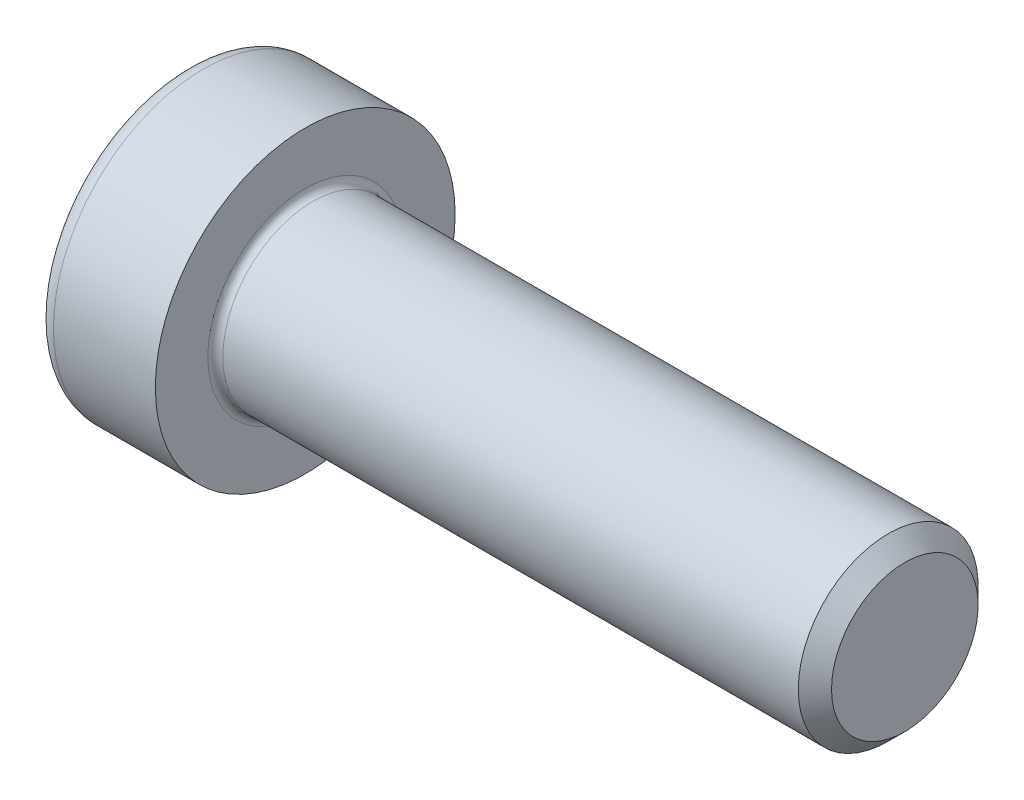
ISO-10303-21;
HEADER;
FILE_DESCRIPTION(('STEP AP214'),'2;1');
FILE_NAME('part.step','',(''),(''),'','','');
FILE_SCHEMA(('AUTOMOTIVE_DESIGN { 1 0 10303 214 1 1 1 1 }'));
ENDSEC;
DATA;
#1=APPLICATION_CONTEXT('core data for automotive mechanical design processes');
#2=APPLICATION_PROTOCOL_DEFINITION('international standard','automotive_design',2000,#1);
#3=PRODUCT_CONTEXT('',#1,'mechanical');
#4=PRODUCT('Part','Part','',(#3));
#5=PRODUCT_RELATED_PRODUCT_CATEGORY('part','',(#4));
#6=PRODUCT_DEFINITION_FORMATION('','',#4);
#7=PRODUCT_DEFINITION_CONTEXT('part definition',#1,'design');
#8=PRODUCT_DEFINITION('design','',#6,#7);
#9=PRODUCT_DEFINITION_SHAPE('','',#8);
#10=(LENGTH_UNIT() NAMED_UNIT(*) SI_UNIT(.MILLI.,.METRE.));
#11=(NAMED_UNIT(*) PLANE_ANGLE_UNIT() SI_UNIT($,.RADIAN.));
#12=(NAMED_UNIT(*) SI_UNIT($,.STERADIAN.) SOLID_ANGLE_UNIT());
#13=UNCERTAINTY_MEASURE_WITH_UNIT(LENGTH_MEASURE(1.E-05),#10,'distance_accuracy_value','');
#14=(GEOMETRIC_REPRESENTATION_CONTEXT(3) GLOBAL_UNCERTAINTY_ASSIGNED_CONTEXT((#13)) GLOBAL_UNIT_ASSIGNED_CONTEXT((#10,
#11,#12)) REPRESENTATION_CONTEXT('',''));
#15=CARTESIAN_POINT('',(0.,0.,0.));
#16=DIRECTION('',(0.,0.,1.));
#17=DIRECTION('',(1.,0.,0.));
#18=AXIS2_PLACEMENT_3D('',#15,#16,#17);
#19=CARTESIAN_POINT('',(0.,0.,0.));
#20=DIRECTION('',(-1.,0.,0.));
#21=DIRECTION('',(0.,0.,1.));
#22=AXIS2_PLACEMENT_3D('',#19,#20,#21);
#23=PLANE('',#22);
#24=DIRECTION('',(0.,-0.499999999999998,0.86602540378444));
#25=VECTOR('',#24,1.);
#26=CARTESIAN_POINT('',(0.,2.30940107675851,0.));
#27=LINE('',#26,#25);
#28=CARTESIAN_POINT('',(0.,2.30940107675851,0.));
#29=VERTEX_POINT('',#28);
#30=CARTESIAN_POINT('',(0.,1.15470053837926,1.99999999999999));
#31=VERTEX_POINT('',#30);
#32=EDGE_CURVE('E296',#29,#31,#27,.T.);
#33=ORIENTED_EDGE('',*,*,#32,.T.);
#34=DIRECTION('',(0.,1.,0.));
#35=VECTOR('',#34,1.);
#36=CARTESIAN_POINT('',(0.,-1.15470053837924,2.));
#37=LINE('',#36,#35);
#38=CARTESIAN_POINT('',(0.,-1.15470053837924,2.));
#39=VERTEX_POINT('',#38);
#40=EDGE_CURVE('E150',#39,#31,#37,.T.);
#41=ORIENTED_EDGE('',*,*,#40,.F.);
#42=DIRECTION('',(0.,-0.500000000000001,-0.866025403784438));
#43=VECTOR('',#42,1.);
#44=CARTESIAN_POINT('',(0.,-1.15470053837924,2.));
#45=LINE('',#44,#43);
#46=CARTESIAN_POINT('',(0.,-2.30940107675849,0.));
#47=VERTEX_POINT('',#46);
#48=EDGE_CURVE('E301',#39,#47,#45,.T.);
#49=ORIENTED_EDGE('',*,*,#48,.T.);
#50=DIRECTION('',(0.,0.499999999999997,-0.86602540378444));
#51=VECTOR('',#50,1.);
#52=CARTESIAN_POINT('',(0.,-2.30940107675849,0.));
#53=LINE('',#52,#51);
#54=CARTESIAN_POINT('',(0.,-1.15470053837925,-2.));
#55=VERTEX_POINT('',#54);
#56=EDGE_CURVE('E305',#47,#55,#53,.T.);
#57=ORIENTED_EDGE('',*,*,#56,.T.);
#58=DIRECTION('',(0.,-1.,0.));
#59=VECTOR('',#58,1.);
#60=CARTESIAN_POINT('',(0.,1.15470053837925,-2.00000000000001));
#61=LINE('',#60,#59);
#62=CARTESIAN_POINT('',(0.,1.15470053837925,-2.00000000000001));
#63=VERTEX_POINT('',#62);
#64=EDGE_CURVE('E309',#63,#55,#61,.T.);
#65=ORIENTED_EDGE('',*,*,#64,.F.);
#66=DIRECTION('',(0.,-0.500000000000001,-0.866025403784438));
#67=VECTOR('',#66,1.);
#68=CARTESIAN_POINT('',(0.,2.30940107675851,0.));
#69=LINE('',#68,#67);
#70=EDGE_CURVE('E145',#29,#63,#69,.T.);
#71=ORIENTED_EDGE('',*,*,#70,.F.);
#72=EDGE_LOOP('',(#33,#41,#49,#57,#65,#71));
#73=FACE_BOUND('',#72,.T.);
#74=CARTESIAN_POINT('',(0.,0.,0.));
#75=DIRECTION('',(-1.,0.,0.));
#76=DIRECTION('',(0.,0.,1.));
#77=AXIS2_PLACEMENT_3D('',#74,#75,#76);
#78=CIRCLE('',#77,4.4);
#79=CARTESIAN_POINT('',(0.,0.,4.4));
#80=VERTEX_POINT('',#79);
#81=EDGE_CURVE('E60',#80,#80,#78,.T.);
#82=ORIENTED_EDGE('',*,*,#81,.T.);
#83=EDGE_LOOP('',(#82));
#84=FACE_BOUND('',#83,.T.);
#85=ADVANCED_FACE('F51',(#73,#84),#23,.T.);
#86=CARTESIAN_POINT('',(-31.75,0.,0.));
#87=DIRECTION('',(-1.,0.,0.));
#88=DIRECTION('',(0.,0.,1.));
#89=AXIS2_PLACEMENT_3D('',#86,#87,#88);
#90=CYLINDRICAL_SURFACE('',#89,5.);
#91=CARTESIAN_POINT('',(0.600000000000003,0.,0.));
#92=DIRECTION('',(-1.,0.,0.));
#93=DIRECTION('',(0.,0.,1.));
#94=AXIS2_PLACEMENT_3D('',#91,#92,#93);
#95=CIRCLE('',#94,5.);
#96=CARTESIAN_POINT('',(0.600000000000003,0.,5.));
#97=VERTEX_POINT('',#96);
#98=EDGE_CURVE('E11',#97,#97,#95,.F.);
#99=ORIENTED_EDGE('',*,*,#98,.T.);
#100=EDGE_LOOP('',(#99));
#101=FACE_BOUND('',#100,.T.);
#102=CARTESIAN_POINT('',(4.,0.,0.));
#103=DIRECTION('',(-1.,0.,0.));
#104=DIRECTION('',(0.,0.,1.));
#105=AXIS2_PLACEMENT_3D('',#102,#103,#104);
#106=CIRCLE('',#105,5.);
#107=CARTESIAN_POINT('',(4.,0.,5.));
#108=VERTEX_POINT('',#107);
#109=EDGE_CURVE('E175',#108,#108,#106,.T.);
#110=ORIENTED_EDGE('',*,*,#109,.T.);
#111=EDGE_LOOP('',(#110));
#112=FACE_BOUND('',#111,.T.);
#113=ADVANCED_FACE('F205',(#101,#112),#90,.T.);
#114=CARTESIAN_POINT('',(4.,5.,0.));
#115=DIRECTION('',(1.,0.,0.));
#116=DIRECTION('',(0.,0.,-1.));
#117=AXIS2_PLACEMENT_3D('',#114,#115,#116);
#118=PLANE('',#117);
#119=CARTESIAN_POINT('',(4.,0.,0.));
#120=DIRECTION('',(1.,0.,0.));
#121=DIRECTION('',(0.,0.,-1.));
#122=AXIS2_PLACEMENT_3D('',#119,#120,#121);
#123=CIRCLE('',#122,3.25);
#124=CARTESIAN_POINT('',(4.,0.,-3.25));
#125=VERTEX_POINT('',#124);
#126=EDGE_CURVE('E179',#125,#125,#123,.F.);
#127=ORIENTED_EDGE('',*,*,#126,.T.);
#128=EDGE_LOOP('',(#127));
#129=FACE_BOUND('',#128,.T.);
#130=ORIENTED_EDGE('',*,*,#109,.F.);
#131=EDGE_LOOP('',(#130));
#132=FACE_BOUND('',#131,.T.);
#133=ADVANCED_FACE('F210',(#129,#132),#118,.T.);
#134=CARTESIAN_POINT('',(-31.75,0.,0.));
#135=DIRECTION('',(-1.,0.,0.));
#136=DIRECTION('',(0.,0.,1.));
#137=AXIS2_PLACEMENT_3D('',#134,#135,#136);
#138=CYLINDRICAL_SURFACE('',#137,3.);
#139=CARTESIAN_POINT('',(4.25,0.,0.));
#140=DIRECTION('',(1.,0.,0.));
#141=DIRECTION('',(0.,0.,-1.));
#142=AXIS2_PLACEMENT_3D('',#139,#140,#141);
#143=CIRCLE('',#142,3.);
#144=CARTESIAN_POINT('',(4.25,0.,-3.));
#145=VERTEX_POINT('',#144);
#146=EDGE_CURVE('E183',#145,#145,#143,.T.);
#147=ORIENTED_EDGE('',*,*,#146,.T.);
#148=EDGE_LOOP('',(#147));
#149=FACE_BOUND('',#148,.T.);
#150=CARTESIAN_POINT('',(23.4455,0.,0.));
#151=DIRECTION('',(-1.,0.,0.));
#152=DIRECTION('',(0.,0.,1.));
#153=AXIS2_PLACEMENT_3D('',#150,#151,#152);
#154=CIRCLE('',#153,3.);
#155=CARTESIAN_POINT('',(23.4455,0.,3.));
#156=VERTEX_POINT('',#155);
#157=EDGE_CURVE('E171',#156,#156,#154,.T.);
#158=ORIENTED_EDGE('',*,*,#157,.T.);
#159=EDGE_LOOP('',(#158));
#160=FACE_BOUND('',#159,.T.);
#161=ADVANCED_FACE('F216',(#149,#160),#138,.T.);
#162=CARTESIAN_POINT('',(24.,0.,0.));
#163=DIRECTION('',(-1.,0.,0.));
#164=DIRECTION('',(0.,0.,1.));
#165=AXIS2_PLACEMENT_3D('',#162,#163,#164);
#166=CONICAL_SURFACE('',#165,2.4455,0.785398163397454);
#167=ORIENTED_EDGE('',*,*,#157,.F.);
#168=EDGE_LOOP('',(#167));
#169=FACE_BOUND('',#168,.T.);
#170=CARTESIAN_POINT('',(24.,0.,0.));
#171=DIRECTION('',(-1.,0.,0.));
#172=DIRECTION('',(0.,0.,1.));
#173=AXIS2_PLACEMENT_3D('',#170,#171,#172);
#174=CIRCLE('',#173,2.4455);
#175=CARTESIAN_POINT('',(24.,0.,2.4455));
#176=VERTEX_POINT('',#175);
#177=EDGE_CURVE('E166',#176,#176,#174,.T.);
#178=ORIENTED_EDGE('',*,*,#177,.T.);
#179=EDGE_LOOP('',(#178));
#180=FACE_BOUND('',#179,.T.);
#181=ADVANCED_FACE('F220',(#169,#180),#166,.T.);
#182=CARTESIAN_POINT('',(24.,2.4455,0.));
#183=DIRECTION('',(1.,0.,0.));
#184=DIRECTION('',(0.,0.,-1.));
#185=AXIS2_PLACEMENT_3D('',#182,#183,#184);
#186=PLANE('',#185);
#187=ORIENTED_EDGE('',*,*,#177,.F.);
#188=EDGE_LOOP('',(#187));
#189=FACE_BOUND('',#188,.T.);
#190=ADVANCED_FACE('F202',(#189),#186,.T.);
#191=CARTESIAN_POINT('',(4.25,0.,0.));
#192=DIRECTION('',(1.,0.,0.));
#193=DIRECTION('',(0.,0.,-1.));
#194=AXIS2_PLACEMENT_3D('',#191,#192,#193);
#195=TOROIDAL_SURFACE('',#194,3.25,0.25);
#196=ORIENTED_EDGE('',*,*,#146,.F.);
#197=EDGE_LOOP('',(#196));
#198=FACE_BOUND('',#197,.T.);
#199=ORIENTED_EDGE('',*,*,#126,.F.);
#200=EDGE_LOOP('',(#199));
#201=FACE_BOUND('',#200,.T.);
#202=ADVANCED_FACE('F193',(#198,#201),#195,.F.);
#203=CARTESIAN_POINT('',(0.600000000000003,0.,0.));
#204=DIRECTION('',(-1.,0.,0.));
#205=DIRECTION('',(0.,0.,1.));
#206=AXIS2_PLACEMENT_3D('',#203,#204,#205);
#207=TOROIDAL_SURFACE('',#206,4.4,0.6);
#208=ORIENTED_EDGE('',*,*,#98,.F.);
#209=EDGE_LOOP('',(#208));
#210=FACE_BOUND('',#209,.T.);
#211=ORIENTED_EDGE('',*,*,#81,.F.);
#212=EDGE_LOOP('',(#211));
#213=FACE_BOUND('',#212,.T.);
#214=ADVANCED_FACE('F53',(#210,#213),#207,.T.);
#215=CARTESIAN_POINT('',(3.,2.30940107675851,0.));
#216=DIRECTION('',(0.,-0.86602540378444,-0.499999999999998));
#217=DIRECTION('',(0.,0.499999999999998,-0.86602540378444));
#218=AXIS2_PLACEMENT_3D('',#215,#216,#217);
#219=PLANE('',#218);
#220=ORIENTED_EDGE('',*,*,#32,.F.);
#221=DIRECTION('',(-1.,0.,0.));
#222=VECTOR('',#221,1.);
#223=CARTESIAN_POINT('',(3.,2.30940107675851,0.));
#224=LINE('',#223,#222);
#225=CARTESIAN_POINT('',(3.,2.30940107675851,0.));
#226=VERTEX_POINT('',#225);
#227=EDGE_CURVE('E282',#226,#29,#224,.T.);
#228=ORIENTED_EDGE('',*,*,#227,.F.);
#229=DIRECTION('',(0.,-0.499999999999998,0.86602540378444));
#230=VECTOR('',#229,1.);
#231=CARTESIAN_POINT('',(3.,2.30940107675851,0.));
#232=LINE('',#231,#230);
#233=CARTESIAN_POINT('',(3.,1.73205080756888,0.999999999999997));
#234=VERTEX_POINT('',#233);
#235=EDGE_CURVE('E136',#226,#234,#232,.T.);
#236=ORIENTED_EDGE('',*,*,#235,.T.);
#237=CARTESIAN_POINT('',(3.,1.15470053837926,1.99999999999999));
#238=VERTEX_POINT('',#237);
#239=EDGE_CURVE('E126',#234,#238,#232,.T.);
#240=ORIENTED_EDGE('',*,*,#239,.T.);
#241=DIRECTION('',(-1.,0.,0.));
#242=VECTOR('',#241,1.);
#243=CARTESIAN_POINT('',(3.,1.15470053837926,1.99999999999999));
#244=LINE('',#243,#242);
#245=EDGE_CURVE('E141',#238,#31,#244,.T.);
#246=ORIENTED_EDGE('',*,*,#245,.T.);
#247=EDGE_LOOP('',(#220,#228,#236,#240,#246));
#248=FACE_BOUND('',#247,.T.);
#249=ADVANCED_FACE('F140',(#248),#219,.T.);
#250=CARTESIAN_POINT('',(3.,-1.15470053837924,2.));
#251=DIRECTION('',(0.,0.,1.));
#252=DIRECTION('',(0.,-1.,0.));
#253=AXIS2_PLACEMENT_3D('',#250,#251,#252);
#254=PLANE('',#253);
#255=ORIENTED_EDGE('',*,*,#40,.T.);
#256=ORIENTED_EDGE('',*,*,#245,.F.);
#257=DIRECTION('',(0.,1.,0.));
#258=VECTOR('',#257,1.);
#259=CARTESIAN_POINT('',(3.,-1.15470053837924,2.));
#260=LINE('',#259,#258);
#261=CARTESIAN_POINT('',(3.,0.,1.99999999999999));
#262=VERTEX_POINT('',#261);
#263=EDGE_CURVE('E123',#262,#238,#260,.T.);
#264=ORIENTED_EDGE('',*,*,#263,.F.);
#265=CARTESIAN_POINT('',(3.,-1.15470053837924,2.));
#266=VERTEX_POINT('',#265);
#267=EDGE_CURVE('E135',#266,#262,#260,.T.);
#268=ORIENTED_EDGE('',*,*,#267,.F.);
#269=DIRECTION('',(-1.,0.,0.));
#270=VECTOR('',#269,1.);
#271=CARTESIAN_POINT('',(3.,-1.15470053837924,2.));
#272=LINE('',#271,#270);
#273=EDGE_CURVE('E153',#266,#39,#272,.T.);
#274=ORIENTED_EDGE('',*,*,#273,.T.);
#275=EDGE_LOOP('',(#255,#256,#264,#268,#274));
#276=FACE_BOUND('',#275,.T.);
#277=ADVANCED_FACE('F147',(#276),#254,.F.);
#278=CARTESIAN_POINT('',(3.,-1.15470053837924,2.));
#279=DIRECTION('',(0.,0.866025403784438,-0.500000000000001));
#280=DIRECTION('',(0.,0.500000000000001,0.866025403784438));
#281=AXIS2_PLACEMENT_3D('',#278,#279,#280);
#282=PLANE('',#281);
#283=ORIENTED_EDGE('',*,*,#48,.F.);
#284=ORIENTED_EDGE('',*,*,#273,.F.);
#285=DIRECTION('',(0.,-0.500000000000001,-0.866025403784438));
#286=VECTOR('',#285,1.);
#287=CARTESIAN_POINT('',(3.,-1.15470053837924,2.));
#288=LINE('',#287,#286);
#289=CARTESIAN_POINT('',(3.,-1.73205080756887,0.999999999999997));
#290=VERTEX_POINT('',#289);
#291=EDGE_CURVE('E344',#266,#290,#288,.T.);
#292=ORIENTED_EDGE('',*,*,#291,.T.);
#293=CARTESIAN_POINT('',(3.,-2.30940107675849,0.));
#294=VERTEX_POINT('',#293);
#295=EDGE_CURVE('E324',#290,#294,#288,.T.);
#296=ORIENTED_EDGE('',*,*,#295,.T.);
#297=DIRECTION('',(-1.,0.,0.));
#298=VECTOR('',#297,1.);
#299=CARTESIAN_POINT('',(3.,-2.30940107675849,0.));
#300=LINE('',#299,#298);
#301=EDGE_CURVE('E161',#294,#47,#300,.T.);
#302=ORIENTED_EDGE('',*,*,#301,.T.);
#303=EDGE_LOOP('',(#283,#284,#292,#296,#302));
#304=FACE_BOUND('',#303,.T.);
#305=ADVANCED_FACE('F234',(#304),#282,.T.);
#306=CARTESIAN_POINT('',(3.,-2.30940107675849,0.));
#307=DIRECTION('',(0.,0.86602540378444,0.499999999999998));
#308=DIRECTION('',(0.,-0.499999999999998,0.86602540378444));
#309=AXIS2_PLACEMENT_3D('',#306,#307,#308);
#310=PLANE('',#309);
#311=ORIENTED_EDGE('',*,*,#56,.F.);
#312=ORIENTED_EDGE('',*,*,#301,.F.);
#313=DIRECTION('',(0.,0.499999999999997,-0.86602540378444));
#314=VECTOR('',#313,1.);
#315=CARTESIAN_POINT('',(3.,-2.30940107675849,0.));
#316=LINE('',#315,#314);
#317=CARTESIAN_POINT('',(3.,-1.73205080756888,-0.999999999999993));
#318=VERTEX_POINT('',#317);
#319=EDGE_CURVE('E291',#294,#318,#316,.T.);
#320=ORIENTED_EDGE('',*,*,#319,.T.);
#321=CARTESIAN_POINT('',(3.,-1.15470053837925,-2.));
#322=VERTEX_POINT('',#321);
#323=EDGE_CURVE('E342',#318,#322,#316,.T.);
#324=ORIENTED_EDGE('',*,*,#323,.T.);
#325=DIRECTION('',(-1.,0.,0.));
#326=VECTOR('',#325,1.);
#327=CARTESIAN_POINT('',(3.,-1.15470053837925,-2.));
#328=LINE('',#327,#326);
#329=EDGE_CURVE('E281',#322,#55,#328,.T.);
#330=ORIENTED_EDGE('',*,*,#329,.T.);
#331=EDGE_LOOP('',(#311,#312,#320,#324,#330));
#332=FACE_BOUND('',#331,.T.);
#333=ADVANCED_FACE('F237',(#332),#310,.T.);
#334=CARTESIAN_POINT('',(3.,1.15470053837925,-2.00000000000001));
#335=DIRECTION('',(0.,0.,-1.));
#336=DIRECTION('',(0.,1.,0.));
#337=AXIS2_PLACEMENT_3D('',#334,#335,#336);
#338=PLANE('',#337);
#339=ORIENTED_EDGE('',*,*,#64,.T.);
#340=ORIENTED_EDGE('',*,*,#329,.F.);
#341=DIRECTION('',(0.,-1.,0.));
#342=VECTOR('',#341,1.);
#343=CARTESIAN_POINT('',(3.,1.15470053837925,-2.00000000000001));
#344=LINE('',#343,#342);
#345=CARTESIAN_POINT('',(3.,0.,-2.));
#346=VERTEX_POINT('',#345);
#347=EDGE_CURVE('E285',#346,#322,#344,.T.);
#348=ORIENTED_EDGE('',*,*,#347,.F.);
#349=CARTESIAN_POINT('',(3.,1.15470053837925,-2.00000000000001));
#350=VERTEX_POINT('',#349);
#351=EDGE_CURVE('E67',#350,#346,#344,.T.);
#352=ORIENTED_EDGE('',*,*,#351,.F.);
#353=DIRECTION('',(-1.,0.,0.));
#354=VECTOR('',#353,1.);
#355=CARTESIAN_POINT('',(3.,1.15470053837925,-2.00000000000001));
#356=LINE('',#355,#354);
#357=EDGE_CURVE('E277',#350,#63,#356,.T.);
#358=ORIENTED_EDGE('',*,*,#357,.T.);
#359=EDGE_LOOP('',(#339,#340,#348,#352,#358));
#360=FACE_BOUND('',#359,.T.);
#361=ADVANCED_FACE('F241',(#360),#338,.F.);
#362=CARTESIAN_POINT('',(3.,2.30940107675851,0.));
#363=DIRECTION('',(0.,0.866025403784438,-0.500000000000001));
#364=DIRECTION('',(0.,0.500000000000001,0.866025403784438));
#365=AXIS2_PLACEMENT_3D('',#362,#363,#364);
#366=PLANE('',#365);
#367=ORIENTED_EDGE('',*,*,#70,.T.);
#368=ORIENTED_EDGE('',*,*,#357,.F.);
#369=DIRECTION('',(0.,-0.500000000000001,-0.866025403784438));
#370=VECTOR('',#369,1.);
#371=CARTESIAN_POINT('',(3.,2.30940107675851,0.));
#372=LINE('',#371,#370);
#373=CARTESIAN_POINT('',(3.,1.73205080756888,-1.00000000000001));
#374=VERTEX_POINT('',#373);
#375=EDGE_CURVE('E266',#374,#350,#372,.T.);
#376=ORIENTED_EDGE('',*,*,#375,.F.);
#377=EDGE_CURVE('E273',#226,#374,#372,.T.);
#378=ORIENTED_EDGE('',*,*,#377,.F.);
#379=ORIENTED_EDGE('',*,*,#227,.T.);
#380=EDGE_LOOP('',(#367,#368,#376,#378,#379));
#381=FACE_BOUND('',#380,.T.);
#382=ADVANCED_FACE('F245',(#381),#366,.F.);
#383=CARTESIAN_POINT('',(3.,3.46410161513775,-2.00000000000001));
#384=DIRECTION('',(1.,0.,0.));
#385=DIRECTION('',(0.,0.,-1.));
#386=AXIS2_PLACEMENT_3D('',#383,#384,#385);
#387=PLANE('',#386);
#388=ORIENTED_EDGE('',*,*,#347,.T.);
#389=ORIENTED_EDGE('',*,*,#323,.F.);
#390=CARTESIAN_POINT('',(3.,0.,0.));
#391=DIRECTION('',(-1.,0.,0.));
#392=DIRECTION('',(0.,0.,1.));
#393=AXIS2_PLACEMENT_3D('',#390,#391,#392);
#394=CIRCLE('',#393,2.);
#395=EDGE_CURVE('E333',#346,#318,#394,.T.);
#396=ORIENTED_EDGE('',*,*,#395,.F.);
#397=EDGE_LOOP('',(#388,#389,#396));
#398=FACE_BOUND('',#397,.T.);
#399=ADVANCED_FACE('F249',(#398),#387,.F.);
#400=ORIENTED_EDGE('',*,*,#319,.F.);
#401=ORIENTED_EDGE('',*,*,#295,.F.);
#402=EDGE_CURVE('E159',#318,#290,#394,.T.);
#403=ORIENTED_EDGE('',*,*,#402,.F.);
#404=EDGE_LOOP('',(#400,#401,#403));
#405=FACE_BOUND('',#404,.T.);
#406=ADVANCED_FACE('F252',(#405),#387,.F.);
#407=ORIENTED_EDGE('',*,*,#291,.F.);
#408=ORIENTED_EDGE('',*,*,#267,.T.);
#409=EDGE_CURVE('E152',#290,#262,#394,.T.);
#410=ORIENTED_EDGE('',*,*,#409,.F.);
#411=EDGE_LOOP('',(#407,#408,#410));
#412=FACE_BOUND('',#411,.T.);
#413=ADVANCED_FACE('F257',(#412),#387,.F.);
#414=ORIENTED_EDGE('',*,*,#263,.T.);
#415=ORIENTED_EDGE('',*,*,#239,.F.);
#416=EDGE_CURVE('E129',#262,#234,#394,.T.);
#417=ORIENTED_EDGE('',*,*,#416,.F.);
#418=EDGE_LOOP('',(#414,#415,#417));
#419=FACE_BOUND('',#418,.T.);
#420=ADVANCED_FACE('F125',(#419),#387,.F.);
#421=ORIENTED_EDGE('',*,*,#235,.F.);
#422=ORIENTED_EDGE('',*,*,#377,.T.);
#423=EDGE_CURVE('E167',#234,#374,#394,.T.);
#424=ORIENTED_EDGE('',*,*,#423,.F.);
#425=EDGE_LOOP('',(#421,#422,#424));
#426=FACE_BOUND('',#425,.T.);
#427=ADVANCED_FACE('F260',(#426),#387,.F.);
#428=ORIENTED_EDGE('',*,*,#375,.T.);
#429=ORIENTED_EDGE('',*,*,#351,.T.);
#430=EDGE_CURVE('E269',#374,#346,#394,.T.);
#431=ORIENTED_EDGE('',*,*,#430,.F.);
#432=EDGE_LOOP('',(#428,#429,#431));
#433=FACE_BOUND('',#432,.T.);
#434=ADVANCED_FACE('F230',(#433),#387,.F.);
#435=CARTESIAN_POINT('',(3.,0.,0.));
#436=DIRECTION('',(-1.,0.,0.));
#437=DIRECTION('',(0.,0.,1.));
#438=AXIS2_PLACEMENT_3D('',#435,#436,#437);
#439=CONICAL_SURFACE('',#438,2.,1.04719755119659);
#440=CARTESIAN_POINT('',(4.15470053837927,0.,0.));
#441=VERTEX_POINT('',#440);
#442=VERTEX_LOOP('',#441);
#443=FACE_BOUND('',#442,.T.);
#444=ORIENTED_EDGE('',*,*,#416,.T.);
#445=ORIENTED_EDGE('',*,*,#423,.T.);
#446=ORIENTED_EDGE('',*,*,#430,.T.);
#447=ORIENTED_EDGE('',*,*,#395,.T.);
#448=ORIENTED_EDGE('',*,*,#402,.T.);
#449=ORIENTED_EDGE('',*,*,#409,.T.);
#450=EDGE_LOOP('',(#444,#445,#446,#447,#448,#449));
#451=FACE_BOUND('',#450,.T.);
#452=ADVANCED_FACE('F228',(#443,#451),#439,.F.);
#453=CLOSED_SHELL('',(#85,#113,#133,#161,#181,#190,#202,#214,#249,#277,#305,#333,#361,#382,#399,
#406,#413,#420,#427,#434,#452));
#454=MANIFOLD_SOLID_BREP('B2',#453);
#455=ADVANCED_BREP_SHAPE_REPRESENTATION('',(#18,#454),#14);
#456=SHAPE_DEFINITION_REPRESENTATION(#9,#455);
ENDSEC;
END-ISO-10303-21;
